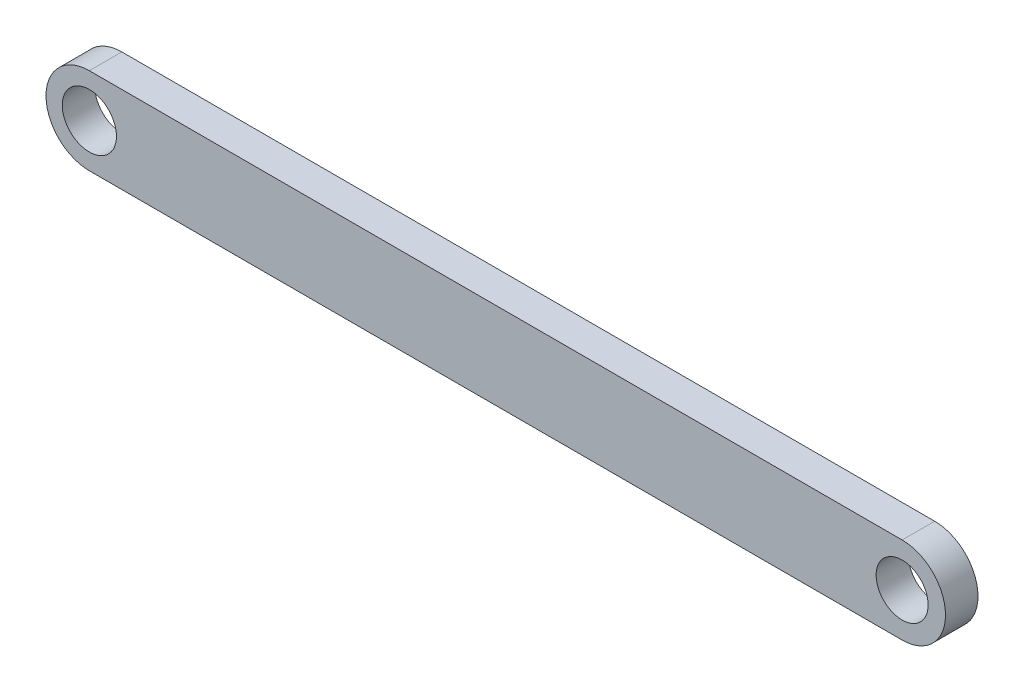
ISO-10303-21;
HEADER;
FILE_DESCRIPTION(('STEP AP214'),'2;1');
FILE_NAME('part.step','',(''),(''),'','','');
FILE_SCHEMA(('AUTOMOTIVE_DESIGN { 1 0 10303 214 1 1 1 1 }'));
ENDSEC;
DATA;
#1=APPLICATION_CONTEXT('core data for automotive mechanical design processes');
#2=APPLICATION_PROTOCOL_DEFINITION('international standard','automotive_design',2000,#1);
#3=PRODUCT_CONTEXT('',#1,'mechanical');
#4=PRODUCT('Part','Part','',(#3));
#5=PRODUCT_RELATED_PRODUCT_CATEGORY('part','',(#4));
#6=PRODUCT_DEFINITION_FORMATION('','',#4);
#7=PRODUCT_DEFINITION_CONTEXT('part definition',#1,'design');
#8=PRODUCT_DEFINITION('design','',#6,#7);
#9=PRODUCT_DEFINITION_SHAPE('','',#8);
#10=(LENGTH_UNIT() NAMED_UNIT(*) SI_UNIT(.MILLI.,.METRE.));
#11=(NAMED_UNIT(*) PLANE_ANGLE_UNIT() SI_UNIT($,.RADIAN.));
#12=(NAMED_UNIT(*) SI_UNIT($,.STERADIAN.) SOLID_ANGLE_UNIT());
#13=UNCERTAINTY_MEASURE_WITH_UNIT(LENGTH_MEASURE(1.E-05),#10,'distance_accuracy_value','');
#14=(GEOMETRIC_REPRESENTATION_CONTEXT(3) GLOBAL_UNCERTAINTY_ASSIGNED_CONTEXT((#13)) GLOBAL_UNIT_ASSIGNED_CONTEXT((#10,
#11,#12)) REPRESENTATION_CONTEXT('',''));
#15=CARTESIAN_POINT('',(0.,0.,0.));
#16=DIRECTION('',(0.,0.,1.));
#17=DIRECTION('',(1.,0.,0.));
#18=AXIS2_PLACEMENT_3D('',#15,#16,#17);
#19=CARTESIAN_POINT('',(-30.372366657307,48.1357164631871,3.));
#20=DIRECTION('',(0.,0.,1.));
#21=DIRECTION('',(1.,0.,0.));
#22=AXIS2_PLACEMENT_3D('',#19,#20,#21);
#23=PLANE('',#22);
#24=CARTESIAN_POINT('',(-30.372366657307,48.1357164631871,3.));
#25=DIRECTION('',(0.,0.,1.));
#26=DIRECTION('',(1.,0.,0.));
#27=AXIS2_PLACEMENT_3D('',#24,#25,#26);
#28=CIRCLE('',#27,2.5);
#29=CARTESIAN_POINT('',(-27.872366657307,48.1357164631871,3.));
#30=VERTEX_POINT('',#29);
#31=EDGE_CURVE('E106',#30,#30,#28,.T.);
#32=ORIENTED_EDGE('',*,*,#31,.F.);
#33=EDGE_LOOP('',(#32));
#34=FACE_BOUND('',#33,.T.);
#35=CARTESIAN_POINT('',(-30.372366657307,48.1357164631871,3.));
#36=DIRECTION('',(0.,0.,1.));
#37=DIRECTION('',(1.,0.,0.));
#38=AXIS2_PLACEMENT_3D('',#35,#36,#37);
#39=CIRCLE('',#38,4.);
#40=CARTESIAN_POINT('',(-30.372366657307,52.1357164631871,3.));
#41=VERTEX_POINT('',#40);
#42=CARTESIAN_POINT('',(-30.372366657307,44.1357164631871,3.));
#43=VERTEX_POINT('',#42);
#44=EDGE_CURVE('E91',#41,#43,#39,.T.);
#45=ORIENTED_EDGE('',*,*,#44,.T.);
#46=DIRECTION('',(1.,0.,0.));
#47=VECTOR('',#46,1.);
#48=CARTESIAN_POINT('',(-30.372366657307,44.1357164631871,3.));
#49=LINE('',#48,#47);
#50=CARTESIAN_POINT('',(44.627633342693,44.1357164631871,3.));
#51=VERTEX_POINT('',#50);
#52=EDGE_CURVE('E86',#43,#51,#49,.T.);
#53=ORIENTED_EDGE('',*,*,#52,.T.);
#54=CARTESIAN_POINT('',(44.627633342693,48.1357164631871,3.));
#55=DIRECTION('',(0.,0.,1.));
#56=DIRECTION('',(-1.,0.,0.));
#57=AXIS2_PLACEMENT_3D('',#54,#55,#56);
#58=CIRCLE('',#57,4.);
#59=CARTESIAN_POINT('',(44.627633342693,52.1357164631871,3.));
#60=VERTEX_POINT('',#59);
#61=EDGE_CURVE('E89',#51,#60,#58,.T.);
#62=ORIENTED_EDGE('',*,*,#61,.T.);
#63=DIRECTION('',(-1.,0.,0.));
#64=VECTOR('',#63,1.);
#65=CARTESIAN_POINT('',(-30.372366657307,52.1357164631871,3.));
#66=LINE('',#65,#64);
#67=EDGE_CURVE('E56',#60,#41,#66,.T.);
#68=ORIENTED_EDGE('',*,*,#67,.T.);
#69=EDGE_LOOP('',(#45,#53,#62,#68));
#70=FACE_BOUND('',#69,.T.);
#71=CARTESIAN_POINT('',(44.627633342693,48.1357164631871,3.));
#72=DIRECTION('',(0.,0.,1.));
#73=DIRECTION('',(1.,0.,0.));
#74=AXIS2_PLACEMENT_3D('',#71,#72,#73);
#75=CIRCLE('',#74,2.4);
#76=CARTESIAN_POINT('',(47.027633342693,48.1357164631871,3.));
#77=VERTEX_POINT('',#76);
#78=EDGE_CURVE('E121',#77,#77,#75,.T.);
#79=ORIENTED_EDGE('',*,*,#78,.F.);
#80=EDGE_LOOP('',(#79));
#81=FACE_BOUND('',#80,.T.);
#82=ADVANCED_FACE('F39',(#34,#70,#81),#23,.T.);
#83=CARTESIAN_POINT('',(-30.372366657307,48.1357164631871,0.));
#84=DIRECTION('',(0.,0.,1.));
#85=DIRECTION('',(1.,0.,0.));
#86=AXIS2_PLACEMENT_3D('',#83,#84,#85);
#87=PLANE('',#86);
#88=CARTESIAN_POINT('',(-30.372366657307,48.1357164631871,0.));
#89=DIRECTION('',(0.,0.,1.));
#90=DIRECTION('',(1.,0.,0.));
#91=AXIS2_PLACEMENT_3D('',#88,#89,#90);
#92=CIRCLE('',#91,4.);
#93=CARTESIAN_POINT('',(-30.372366657307,52.1357164631871,0.));
#94=VERTEX_POINT('',#93);
#95=CARTESIAN_POINT('',(-30.372366657307,44.1357164631871,0.));
#96=VERTEX_POINT('',#95);
#97=EDGE_CURVE('E103',#94,#96,#92,.T.);
#98=ORIENTED_EDGE('',*,*,#97,.F.);
#99=DIRECTION('',(-1.,0.,0.));
#100=VECTOR('',#99,1.);
#101=CARTESIAN_POINT('',(-30.372366657307,52.1357164631871,0.));
#102=LINE('',#101,#100);
#103=CARTESIAN_POINT('',(44.627633342693,52.1357164631871,0.));
#104=VERTEX_POINT('',#103);
#105=EDGE_CURVE('E79',#104,#94,#102,.T.);
#106=ORIENTED_EDGE('',*,*,#105,.F.);
#107=CARTESIAN_POINT('',(44.627633342693,48.1357164631871,0.));
#108=DIRECTION('',(0.,0.,1.));
#109=DIRECTION('',(-1.,0.,0.));
#110=AXIS2_PLACEMENT_3D('',#107,#108,#109);
#111=CIRCLE('',#110,4.);
#112=CARTESIAN_POINT('',(44.627633342693,44.1357164631871,0.));
#113=VERTEX_POINT('',#112);
#114=EDGE_CURVE('E73',#113,#104,#111,.T.);
#115=ORIENTED_EDGE('',*,*,#114,.F.);
#116=DIRECTION('',(1.,0.,0.));
#117=VECTOR('',#116,1.);
#118=CARTESIAN_POINT('',(-30.372366657307,44.1357164631871,0.));
#119=LINE('',#118,#117);
#120=EDGE_CURVE('E95',#96,#113,#119,.T.);
#121=ORIENTED_EDGE('',*,*,#120,.F.);
#122=EDGE_LOOP('',(#98,#106,#115,#121));
#123=FACE_BOUND('',#122,.T.);
#124=CARTESIAN_POINT('',(-30.372366657307,48.1357164631871,0.));
#125=DIRECTION('',(0.,0.,1.));
#126=DIRECTION('',(1.,0.,0.));
#127=AXIS2_PLACEMENT_3D('',#124,#125,#126);
#128=CIRCLE('',#127,2.5);
#129=CARTESIAN_POINT('',(-27.872366657307,48.1357164631871,0.));
#130=VERTEX_POINT('',#129);
#131=EDGE_CURVE('E118',#130,#130,#128,.T.);
#132=ORIENTED_EDGE('',*,*,#131,.T.);
#133=EDGE_LOOP('',(#132));
#134=FACE_BOUND('',#133,.T.);
#135=CARTESIAN_POINT('',(44.627633342693,48.1357164631871,0.));
#136=DIRECTION('',(0.,0.,1.));
#137=DIRECTION('',(1.,0.,0.));
#138=AXIS2_PLACEMENT_3D('',#135,#136,#137);
#139=CIRCLE('',#138,2.4);
#140=CARTESIAN_POINT('',(47.027633342693,48.1357164631871,0.));
#141=VERTEX_POINT('',#140);
#142=EDGE_CURVE('E124',#141,#141,#139,.T.);
#143=ORIENTED_EDGE('',*,*,#142,.T.);
#144=EDGE_LOOP('',(#143));
#145=FACE_BOUND('',#144,.T.);
#146=ADVANCED_FACE('F114',(#123,#134,#145),#87,.F.);
#147=CARTESIAN_POINT('',(-30.372366657307,48.1357164631871,3.));
#148=DIRECTION('',(0.,0.,-1.));
#149=DIRECTION('',(-1.,0.,0.));
#150=AXIS2_PLACEMENT_3D('',#147,#148,#149);
#151=CYLINDRICAL_SURFACE('',#150,4.);
#152=ORIENTED_EDGE('',*,*,#97,.T.);
#153=DIRECTION('',(0.,0.,-1.));
#154=VECTOR('',#153,1.);
#155=CARTESIAN_POINT('',(-30.372366657307,44.1357164631871,3.));
#156=LINE('',#155,#154);
#157=EDGE_CURVE('E11',#43,#96,#156,.T.);
#158=ORIENTED_EDGE('',*,*,#157,.F.);
#159=ORIENTED_EDGE('',*,*,#44,.F.);
#160=DIRECTION('',(0.,0.,-1.));
#161=VECTOR('',#160,1.);
#162=CARTESIAN_POINT('',(-30.372366657307,52.1357164631871,3.));
#163=LINE('',#162,#161);
#164=EDGE_CURVE('E99',#41,#94,#163,.T.);
#165=ORIENTED_EDGE('',*,*,#164,.T.);
#166=EDGE_LOOP('',(#152,#158,#159,#165));
#167=FACE_BOUND('',#166,.T.);
#168=ADVANCED_FACE('F41',(#167),#151,.T.);
#169=CARTESIAN_POINT('',(-30.372366657307,44.1357164631871,3.));
#170=DIRECTION('',(0.,1.,0.));
#171=DIRECTION('',(0.,0.,1.));
#172=AXIS2_PLACEMENT_3D('',#169,#170,#171);
#173=PLANE('',#172);
#174=ORIENTED_EDGE('',*,*,#120,.T.);
#175=DIRECTION('',(0.,0.,-1.));
#176=VECTOR('',#175,1.);
#177=CARTESIAN_POINT('',(44.627633342693,44.1357164631871,3.));
#178=LINE('',#177,#176);
#179=EDGE_CURVE('E48',#51,#113,#178,.T.);
#180=ORIENTED_EDGE('',*,*,#179,.F.);
#181=ORIENTED_EDGE('',*,*,#52,.F.);
#182=ORIENTED_EDGE('',*,*,#157,.T.);
#183=EDGE_LOOP('',(#174,#180,#181,#182));
#184=FACE_BOUND('',#183,.T.);
#185=ADVANCED_FACE('F94',(#184),#173,.F.);
#186=CARTESIAN_POINT('',(44.627633342693,48.1357164631871,3.));
#187=DIRECTION('',(0.,0.,-1.));
#188=DIRECTION('',(-1.,0.,0.));
#189=AXIS2_PLACEMENT_3D('',#186,#187,#188);
#190=CYLINDRICAL_SURFACE('',#189,4.);
#191=ORIENTED_EDGE('',*,*,#114,.T.);
#192=DIRECTION('',(0.,0.,-1.));
#193=VECTOR('',#192,1.);
#194=CARTESIAN_POINT('',(44.627633342693,52.1357164631871,3.));
#195=LINE('',#194,#193);
#196=EDGE_CURVE('E96',#60,#104,#195,.T.);
#197=ORIENTED_EDGE('',*,*,#196,.F.);
#198=ORIENTED_EDGE('',*,*,#61,.F.);
#199=ORIENTED_EDGE('',*,*,#179,.T.);
#200=EDGE_LOOP('',(#191,#197,#198,#199));
#201=FACE_BOUND('',#200,.T.);
#202=ADVANCED_FACE('F97',(#201),#190,.T.);
#203=CARTESIAN_POINT('',(-30.372366657307,52.1357164631871,3.));
#204=DIRECTION('',(0.,-1.,0.));
#205=DIRECTION('',(0.,0.,-1.));
#206=AXIS2_PLACEMENT_3D('',#203,#204,#205);
#207=PLANE('',#206);
#208=ORIENTED_EDGE('',*,*,#105,.T.);
#209=ORIENTED_EDGE('',*,*,#164,.F.);
#210=ORIENTED_EDGE('',*,*,#67,.F.);
#211=ORIENTED_EDGE('',*,*,#196,.T.);
#212=EDGE_LOOP('',(#208,#209,#210,#211));
#213=FACE_BOUND('',#212,.T.);
#214=ADVANCED_FACE('F111',(#213),#207,.F.);
#215=CARTESIAN_POINT('',(-30.372366657307,48.1357164631871,3.));
#216=DIRECTION('',(0.,0.,-1.));
#217=DIRECTION('',(-1.,0.,0.));
#218=AXIS2_PLACEMENT_3D('',#215,#216,#217);
#219=CYLINDRICAL_SURFACE('',#218,2.5);
#220=ORIENTED_EDGE('',*,*,#31,.T.);
#221=EDGE_LOOP('',(#220));
#222=FACE_BOUND('',#221,.T.);
#223=ORIENTED_EDGE('',*,*,#131,.F.);
#224=EDGE_LOOP('',(#223));
#225=FACE_BOUND('',#224,.T.);
#226=ADVANCED_FACE('F141',(#222,#225),#219,.F.);
#227=CARTESIAN_POINT('',(44.627633342693,48.1357164631871,3.));
#228=DIRECTION('',(0.,0.,-1.));
#229=DIRECTION('',(-1.,0.,0.));
#230=AXIS2_PLACEMENT_3D('',#227,#228,#229);
#231=CYLINDRICAL_SURFACE('',#230,2.4);
#232=ORIENTED_EDGE('',*,*,#78,.T.);
#233=EDGE_LOOP('',(#232));
#234=FACE_BOUND('',#233,.T.);
#235=ORIENTED_EDGE('',*,*,#142,.F.);
#236=EDGE_LOOP('',(#235));
#237=FACE_BOUND('',#236,.T.);
#238=ADVANCED_FACE('F130',(#234,#237),#231,.F.);
#239=CLOSED_SHELL('',(#82,#146,#168,#185,#202,#214,#226,#238));
#240=MANIFOLD_SOLID_BREP('B2',#239);
#241=ADVANCED_BREP_SHAPE_REPRESENTATION('',(#18,#240),#14);
#242=SHAPE_DEFINITION_REPRESENTATION(#9,#241);
ENDSEC;
END-ISO-10303-21;
